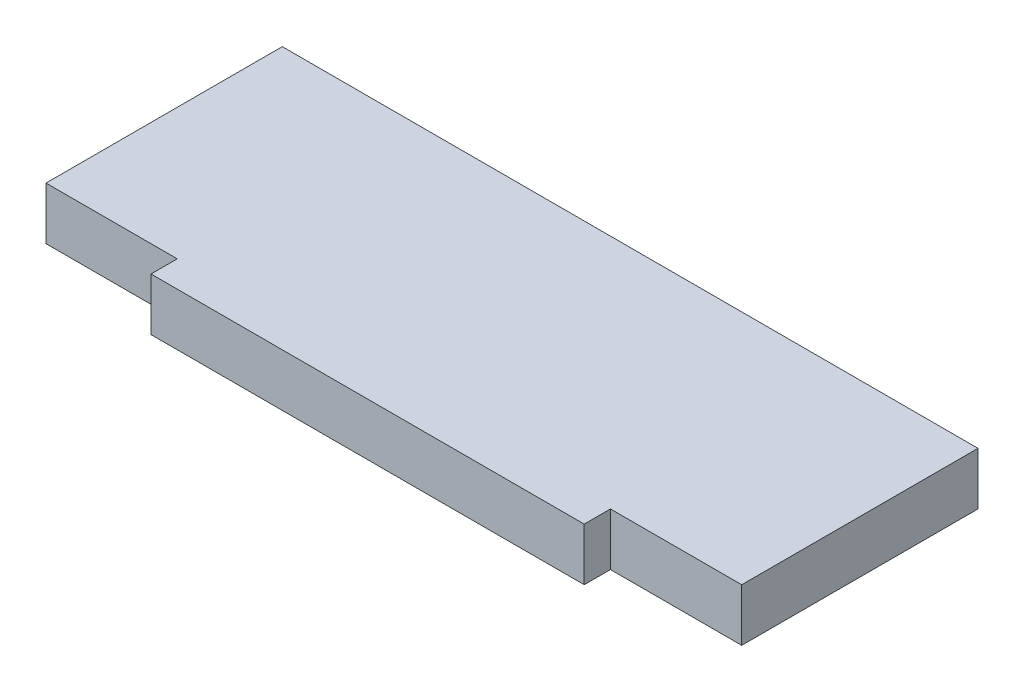
ISO-10303-21;
HEADER;
FILE_DESCRIPTION(('STEP AP214'),'2;1');
FILE_NAME('part.step','',(''),(''),'','','');
FILE_SCHEMA(('AUTOMOTIVE_DESIGN { 1 0 10303 214 1 1 1 1 }'));
ENDSEC;
DATA;
#1=APPLICATION_CONTEXT('core data for automotive mechanical design processes');
#2=APPLICATION_PROTOCOL_DEFINITION('international standard','automotive_design',2000,#1);
#3=PRODUCT_CONTEXT('',#1,'mechanical');
#4=PRODUCT('Part','Part','',(#3));
#5=PRODUCT_RELATED_PRODUCT_CATEGORY('part','',(#4));
#6=PRODUCT_DEFINITION_FORMATION('','',#4);
#7=PRODUCT_DEFINITION_CONTEXT('part definition',#1,'design');
#8=PRODUCT_DEFINITION('design','',#6,#7);
#9=PRODUCT_DEFINITION_SHAPE('','',#8);
#10=(LENGTH_UNIT() NAMED_UNIT(*) SI_UNIT(.MILLI.,.METRE.));
#11=(NAMED_UNIT(*) PLANE_ANGLE_UNIT() SI_UNIT($,.RADIAN.));
#12=(NAMED_UNIT(*) SI_UNIT($,.STERADIAN.) SOLID_ANGLE_UNIT());
#13=UNCERTAINTY_MEASURE_WITH_UNIT(LENGTH_MEASURE(1.E-05),#10,'distance_accuracy_value','');
#14=(GEOMETRIC_REPRESENTATION_CONTEXT(3) GLOBAL_UNCERTAINTY_ASSIGNED_CONTEXT((#13)) GLOBAL_UNIT_ASSIGNED_CONTEXT((#10,
#11,#12)) REPRESENTATION_CONTEXT('',''));
#15=CARTESIAN_POINT('',(0.,0.,0.));
#16=DIRECTION('',(0.,0.,1.));
#17=DIRECTION('',(1.,0.,0.));
#18=AXIS2_PLACEMENT_3D('',#15,#16,#17);
#19=CARTESIAN_POINT('',(26.4999999999999,41.,-20.));
#20=DIRECTION('',(-1.,0.,0.));
#21=DIRECTION('',(0.,0.,1.));
#22=AXIS2_PLACEMENT_3D('',#19,#20,#21);
#23=PLANE('',#22);
#24=DIRECTION('',(0.,0.,1.));
#25=VECTOR('',#24,1.);
#26=CARTESIAN_POINT('',(26.4999999999999,41.,-20.));
#27=LINE('',#26,#25);
#28=CARTESIAN_POINT('',(26.4999999999999,41.,-20.));
#29=VERTEX_POINT('',#28);
#30=CARTESIAN_POINT('',(26.4999999999999,41.,-2.));
#31=VERTEX_POINT('',#30);
#32=EDGE_CURVE('E122',#29,#31,#27,.T.);
#33=ORIENTED_EDGE('',*,*,#32,.T.);
#34=DIRECTION('',(0.,1.,0.));
#35=VECTOR('',#34,1.);
#36=CARTESIAN_POINT('',(26.4999999999999,21.,-2.));
#37=LINE('',#36,#35);
#38=CARTESIAN_POINT('',(26.4999999999999,37.,-2.));
#39=VERTEX_POINT('',#38);
#40=EDGE_CURVE('E104',#39,#31,#37,.T.);
#41=ORIENTED_EDGE('',*,*,#40,.F.);
#42=DIRECTION('',(0.,0.,1.));
#43=VECTOR('',#42,1.);
#44=CARTESIAN_POINT('',(26.4999999999999,37.,-20.));
#45=LINE('',#44,#43);
#46=CARTESIAN_POINT('',(26.4999999999999,37.,-20.));
#47=VERTEX_POINT('',#46);
#48=EDGE_CURVE('E142',#47,#39,#45,.T.);
#49=ORIENTED_EDGE('',*,*,#48,.F.);
#50=DIRECTION('',(0.,-1.,0.));
#51=VECTOR('',#50,1.);
#52=CARTESIAN_POINT('',(26.4999999999999,41.,-20.));
#53=LINE('',#52,#51);
#54=EDGE_CURVE('E127',#29,#47,#53,.T.);
#55=ORIENTED_EDGE('',*,*,#54,.F.);
#56=EDGE_LOOP('',(#33,#41,#49,#55));
#57=FACE_BOUND('',#56,.T.);
#58=ADVANCED_FACE('F40',(#57),#23,.F.);
#59=CARTESIAN_POINT('',(26.4999999999999,37.,-20.));
#60=DIRECTION('',(0.,1.,0.));
#61=DIRECTION('',(-1.,0.,0.));
#62=AXIS2_PLACEMENT_3D('',#59,#60,#61);
#63=PLANE('',#62);
#64=DIRECTION('',(-1.,0.,0.));
#65=VECTOR('',#64,1.);
#66=CARTESIAN_POINT('',(26.4999999999999,37.,-2.));
#67=LINE('',#66,#65);
#68=CARTESIAN_POINT('',(16.4999999999999,37.,-2.));
#69=VERTEX_POINT('',#68);
#70=EDGE_CURVE('E110',#39,#69,#67,.T.);
#71=ORIENTED_EDGE('',*,*,#70,.T.);
#72=DIRECTION('',(0.,0.,1.));
#73=VECTOR('',#72,1.);
#74=CARTESIAN_POINT('',(16.4999999999999,37.,-20.));
#75=LINE('',#74,#73);
#76=CARTESIAN_POINT('',(16.4999999999999,37.,0.));
#77=VERTEX_POINT('',#76);
#78=EDGE_CURVE('E155',#69,#77,#75,.T.);
#79=ORIENTED_EDGE('',*,*,#78,.T.);
#80=DIRECTION('',(-1.,0.,0.));
#81=VECTOR('',#80,1.);
#82=CARTESIAN_POINT('',(26.4999999999999,37.,0.));
#83=LINE('',#82,#81);
#84=CARTESIAN_POINT('',(-16.5000000000001,37.,0.));
#85=VERTEX_POINT('',#84);
#86=EDGE_CURVE('E148',#77,#85,#83,.T.);
#87=ORIENTED_EDGE('',*,*,#86,.T.);
#88=DIRECTION('',(0.,0.,-1.));
#89=VECTOR('',#88,1.);
#90=CARTESIAN_POINT('',(-16.5000000000001,37.,-20.));
#91=LINE('',#90,#89);
#92=CARTESIAN_POINT('',(-16.5000000000001,37.,-2.));
#93=VERTEX_POINT('',#92);
#94=EDGE_CURVE('E54',#85,#93,#91,.T.);
#95=ORIENTED_EDGE('',*,*,#94,.T.);
#96=DIRECTION('',(-1.,0.,0.));
#97=VECTOR('',#96,1.);
#98=CARTESIAN_POINT('',(26.4999999999999,37.,-2.));
#99=LINE('',#98,#97);
#100=CARTESIAN_POINT('',(-26.5000000000001,37.,-2.));
#101=VERTEX_POINT('',#100);
#102=EDGE_CURVE('E156',#93,#101,#99,.T.);
#103=ORIENTED_EDGE('',*,*,#102,.T.);
#104=DIRECTION('',(0.,0.,1.));
#105=VECTOR('',#104,1.);
#106=CARTESIAN_POINT('',(-26.5000000000001,37.,-20.));
#107=LINE('',#106,#105);
#108=CARTESIAN_POINT('',(-26.5000000000001,37.,-20.));
#109=VERTEX_POINT('',#108);
#110=EDGE_CURVE('E132',#109,#101,#107,.T.);
#111=ORIENTED_EDGE('',*,*,#110,.F.);
#112=DIRECTION('',(-1.,0.,0.));
#113=VECTOR('',#112,1.);
#114=CARTESIAN_POINT('',(26.4999999999999,37.,-20.));
#115=LINE('',#114,#113);
#116=EDGE_CURVE('E160',#47,#109,#115,.T.);
#117=ORIENTED_EDGE('',*,*,#116,.F.);
#118=ORIENTED_EDGE('',*,*,#48,.T.);
#119=EDGE_LOOP('',(#71,#79,#87,#95,#103,#111,#117,#118));
#120=FACE_BOUND('',#119,.T.);
#121=ADVANCED_FACE('F153',(#120),#63,.F.);
#122=CARTESIAN_POINT('',(-26.5000000000001,41.,-20.));
#123=DIRECTION('',(1.,0.,0.));
#124=DIRECTION('',(0.,0.,-1.));
#125=AXIS2_PLACEMENT_3D('',#122,#123,#124);
#126=PLANE('',#125);
#127=ORIENTED_EDGE('',*,*,#110,.T.);
#128=DIRECTION('',(0.,1.,0.));
#129=VECTOR('',#128,1.);
#130=CARTESIAN_POINT('',(-26.5000000000001,21.,-2.));
#131=LINE('',#130,#129);
#132=CARTESIAN_POINT('',(-26.5000000000001,41.,-2.));
#133=VERTEX_POINT('',#132);
#134=EDGE_CURVE('E170',#101,#133,#131,.T.);
#135=ORIENTED_EDGE('',*,*,#134,.T.);
#136=DIRECTION('',(0.,0.,1.));
#137=VECTOR('',#136,1.);
#138=CARTESIAN_POINT('',(-26.5000000000001,41.,-20.));
#139=LINE('',#138,#137);
#140=CARTESIAN_POINT('',(-26.5000000000001,41.,-20.));
#141=VERTEX_POINT('',#140);
#142=EDGE_CURVE('E128',#141,#133,#139,.T.);
#143=ORIENTED_EDGE('',*,*,#142,.F.);
#144=DIRECTION('',(0.,1.,0.));
#145=VECTOR('',#144,1.);
#146=CARTESIAN_POINT('',(-26.5000000000001,41.,-20.));
#147=LINE('',#146,#145);
#148=EDGE_CURVE('E134',#109,#141,#147,.T.);
#149=ORIENTED_EDGE('',*,*,#148,.F.);
#150=EDGE_LOOP('',(#127,#135,#143,#149));
#151=FACE_BOUND('',#150,.T.);
#152=ADVANCED_FACE('F183',(#151),#126,.F.);
#153=CARTESIAN_POINT('',(26.4999999999999,41.,-20.));
#154=DIRECTION('',(0.,-1.,0.));
#155=DIRECTION('',(0.,0.,-1.));
#156=AXIS2_PLACEMENT_3D('',#153,#154,#155);
#157=PLANE('',#156);
#158=DIRECTION('',(1.,0.,0.));
#159=VECTOR('',#158,1.);
#160=CARTESIAN_POINT('',(26.4999999999999,41.,0.));
#161=LINE('',#160,#159);
#162=CARTESIAN_POINT('',(-16.5000000000001,41.,0.));
#163=VERTEX_POINT('',#162);
#164=CARTESIAN_POINT('',(16.4999999999999,41.,0.));
#165=VERTEX_POINT('',#164);
#166=EDGE_CURVE('E137',#163,#165,#161,.T.);
#167=ORIENTED_EDGE('',*,*,#166,.T.);
#168=DIRECTION('',(0.,0.,1.));
#169=VECTOR('',#168,1.);
#170=CARTESIAN_POINT('',(16.4999999999999,41.,-2.));
#171=LINE('',#170,#169);
#172=CARTESIAN_POINT('',(16.4999999999999,41.,-2.));
#173=VERTEX_POINT('',#172);
#174=EDGE_CURVE('E62',#173,#165,#171,.T.);
#175=ORIENTED_EDGE('',*,*,#174,.F.);
#176=DIRECTION('',(-1.,0.,0.));
#177=VECTOR('',#176,1.);
#178=CARTESIAN_POINT('',(26.4999999999999,41.,-2.));
#179=LINE('',#178,#177);
#180=EDGE_CURVE('E108',#31,#173,#179,.T.);
#181=ORIENTED_EDGE('',*,*,#180,.F.);
#182=ORIENTED_EDGE('',*,*,#32,.F.);
#183=DIRECTION('',(1.,0.,0.));
#184=VECTOR('',#183,1.);
#185=CARTESIAN_POINT('',(26.4999999999999,41.,-20.));
#186=LINE('',#185,#184);
#187=EDGE_CURVE('E129',#141,#29,#186,.T.);
#188=ORIENTED_EDGE('',*,*,#187,.F.);
#189=ORIENTED_EDGE('',*,*,#142,.T.);
#190=DIRECTION('',(-1.,0.,0.));
#191=VECTOR('',#190,1.);
#192=CARTESIAN_POINT('',(-26.5000000000001,41.,-2.));
#193=LINE('',#192,#191);
#194=CARTESIAN_POINT('',(-16.5000000000001,41.,-2.));
#195=VERTEX_POINT('',#194);
#196=EDGE_CURVE('E167',#195,#133,#193,.T.);
#197=ORIENTED_EDGE('',*,*,#196,.F.);
#198=DIRECTION('',(0.,0.,-1.));
#199=VECTOR('',#198,1.);
#200=CARTESIAN_POINT('',(-16.5000000000001,41.,0.));
#201=LINE('',#200,#199);
#202=EDGE_CURVE('E124',#163,#195,#201,.T.);
#203=ORIENTED_EDGE('',*,*,#202,.F.);
#204=EDGE_LOOP('',(#167,#175,#181,#182,#188,#189,#197,#203));
#205=FACE_BOUND('',#204,.T.);
#206=ADVANCED_FACE('F120',(#205),#157,.F.);
#207=CARTESIAN_POINT('',(0.,0.,-20.));
#208=DIRECTION('',(0.,0.,-1.));
#209=DIRECTION('',(-1.,0.,0.));
#210=AXIS2_PLACEMENT_3D('',#207,#208,#209);
#211=PLANE('',#210);
#212=ORIENTED_EDGE('',*,*,#54,.T.);
#213=ORIENTED_EDGE('',*,*,#116,.T.);
#214=ORIENTED_EDGE('',*,*,#148,.T.);
#215=ORIENTED_EDGE('',*,*,#187,.T.);
#216=EDGE_LOOP('',(#212,#213,#214,#215));
#217=FACE_BOUND('',#216,.T.);
#218=ADVANCED_FACE('F179',(#217),#211,.T.);
#219=CARTESIAN_POINT('',(0.,0.,0.));
#220=DIRECTION('',(0.,0.,-1.));
#221=DIRECTION('',(-1.,0.,0.));
#222=AXIS2_PLACEMENT_3D('',#219,#220,#221);
#223=PLANE('',#222);
#224=ORIENTED_EDGE('',*,*,#86,.F.);
#225=DIRECTION('',(0.,1.,0.));
#226=VECTOR('',#225,1.);
#227=CARTESIAN_POINT('',(16.4999999999999,0.,0.));
#228=LINE('',#227,#226);
#229=EDGE_CURVE('E11',#77,#165,#228,.T.);
#230=ORIENTED_EDGE('',*,*,#229,.T.);
#231=ORIENTED_EDGE('',*,*,#166,.F.);
#232=DIRECTION('',(0.,-1.,0.));
#233=VECTOR('',#232,1.);
#234=CARTESIAN_POINT('',(-16.5000000000001,0.,0.));
#235=LINE('',#234,#233);
#236=EDGE_CURVE('E47',#163,#85,#235,.T.);
#237=ORIENTED_EDGE('',*,*,#236,.T.);
#238=EDGE_LOOP('',(#224,#230,#231,#237));
#239=FACE_BOUND('',#238,.T.);
#240=ADVANCED_FACE('F147',(#239),#223,.F.);
#241=CARTESIAN_POINT('',(-26.5000000000001,21.,-2.));
#242=DIRECTION('',(0.,0.,-1.));
#243=DIRECTION('',(-1.,0.,0.));
#244=AXIS2_PLACEMENT_3D('',#241,#242,#243);
#245=PLANE('',#244);
#246=DIRECTION('',(0.,1.,0.));
#247=VECTOR('',#246,1.);
#248=CARTESIAN_POINT('',(-16.5000000000001,21.,-2.));
#249=LINE('',#248,#247);
#250=EDGE_CURVE('E169',#93,#195,#249,.T.);
#251=ORIENTED_EDGE('',*,*,#250,.T.);
#252=ORIENTED_EDGE('',*,*,#196,.T.);
#253=ORIENTED_EDGE('',*,*,#134,.F.);
#254=ORIENTED_EDGE('',*,*,#102,.F.);
#255=EDGE_LOOP('',(#251,#252,#253,#254));
#256=FACE_BOUND('',#255,.T.);
#257=ADVANCED_FACE('F185',(#256),#245,.F.);
#258=CARTESIAN_POINT('',(-16.5000000000001,21.,0.));
#259=DIRECTION('',(1.,0.,0.));
#260=DIRECTION('',(0.,0.,-1.));
#261=AXIS2_PLACEMENT_3D('',#258,#259,#260);
#262=PLANE('',#261);
#263=ORIENTED_EDGE('',*,*,#236,.F.);
#264=ORIENTED_EDGE('',*,*,#202,.T.);
#265=ORIENTED_EDGE('',*,*,#250,.F.);
#266=ORIENTED_EDGE('',*,*,#94,.F.);
#267=EDGE_LOOP('',(#263,#264,#265,#266));
#268=FACE_BOUND('',#267,.T.);
#269=ADVANCED_FACE('F186',(#268),#262,.F.);
#270=CARTESIAN_POINT('',(26.4999999999999,21.,-2.));
#271=DIRECTION('',(0.,0.,-1.));
#272=DIRECTION('',(-1.,0.,0.));
#273=AXIS2_PLACEMENT_3D('',#270,#271,#272);
#274=PLANE('',#273);
#275=ORIENTED_EDGE('',*,*,#40,.T.);
#276=ORIENTED_EDGE('',*,*,#180,.T.);
#277=DIRECTION('',(0.,1.,0.));
#278=VECTOR('',#277,1.);
#279=CARTESIAN_POINT('',(16.4999999999999,21.,-2.));
#280=LINE('',#279,#278);
#281=EDGE_CURVE('E115',#69,#173,#280,.T.);
#282=ORIENTED_EDGE('',*,*,#281,.F.);
#283=ORIENTED_EDGE('',*,*,#70,.F.);
#284=EDGE_LOOP('',(#275,#276,#282,#283));
#285=FACE_BOUND('',#284,.T.);
#286=ADVANCED_FACE('F106',(#285),#274,.F.);
#287=CARTESIAN_POINT('',(16.4999999999999,21.,-2.));
#288=DIRECTION('',(-1.,0.,0.));
#289=DIRECTION('',(0.,0.,1.));
#290=AXIS2_PLACEMENT_3D('',#287,#288,#289);
#291=PLANE('',#290);
#292=ORIENTED_EDGE('',*,*,#281,.T.);
#293=ORIENTED_EDGE('',*,*,#174,.T.);
#294=ORIENTED_EDGE('',*,*,#229,.F.);
#295=ORIENTED_EDGE('',*,*,#78,.F.);
#296=EDGE_LOOP('',(#292,#293,#294,#295));
#297=FACE_BOUND('',#296,.T.);
#298=ADVANCED_FACE('F175',(#297),#291,.F.);
#299=CLOSED_SHELL('',(#58,#121,#152,#206,#218,#240,#257,#269,#286,#298));
#300=MANIFOLD_SOLID_BREP('B2',#299);
#301=ADVANCED_BREP_SHAPE_REPRESENTATION('',(#18,#300),#14);
#302=SHAPE_DEFINITION_REPRESENTATION(#9,#301);
ENDSEC;
END-ISO-10303-21;
